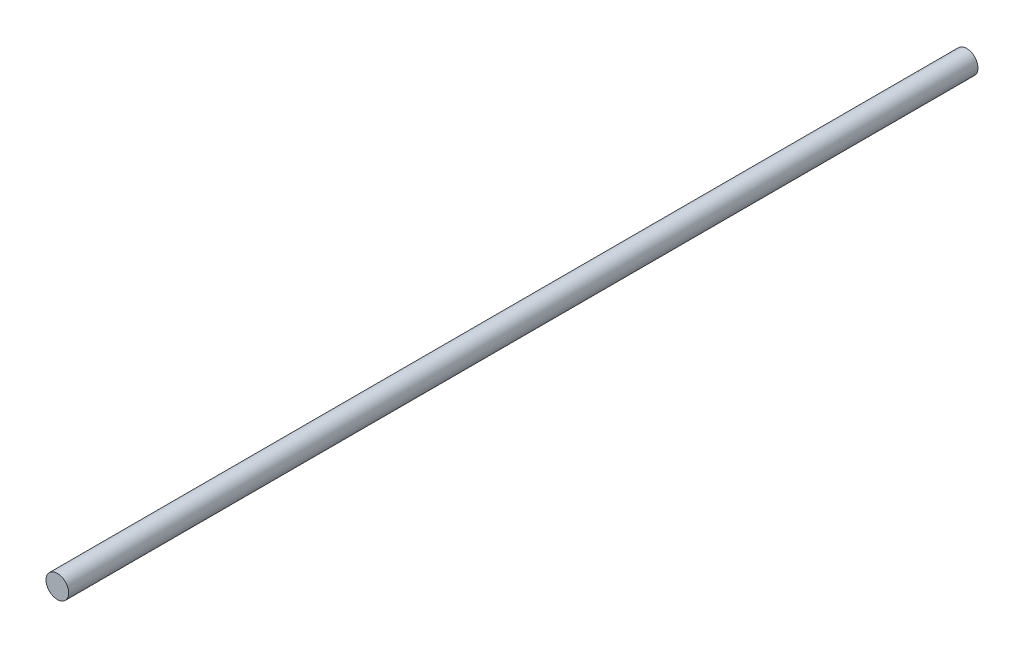
ISO-10303-21;
HEADER;
FILE_DESCRIPTION(('STEP AP214'),'2;1');
FILE_NAME('part.step','',(''),(''),'','','');
FILE_SCHEMA(('AUTOMOTIVE_DESIGN { 1 0 10303 214 1 1 1 1 }'));
ENDSEC;
DATA;
#1=APPLICATION_CONTEXT('core data for automotive mechanical design processes');
#2=APPLICATION_PROTOCOL_DEFINITION('international standard','automotive_design',2000,#1);
#3=PRODUCT_CONTEXT('',#1,'mechanical');
#4=PRODUCT('Part','Part','',(#3));
#5=PRODUCT_RELATED_PRODUCT_CATEGORY('part','',(#4));
#6=PRODUCT_DEFINITION_FORMATION('','',#4);
#7=PRODUCT_DEFINITION_CONTEXT('part definition',#1,'design');
#8=PRODUCT_DEFINITION('design','',#6,#7);
#9=PRODUCT_DEFINITION_SHAPE('','',#8);
#10=(LENGTH_UNIT() NAMED_UNIT(*) SI_UNIT(.MILLI.,.METRE.));
#11=(NAMED_UNIT(*) PLANE_ANGLE_UNIT() SI_UNIT($,.RADIAN.));
#12=(NAMED_UNIT(*) SI_UNIT($,.STERADIAN.) SOLID_ANGLE_UNIT());
#13=UNCERTAINTY_MEASURE_WITH_UNIT(LENGTH_MEASURE(1.E-05),#10,'distance_accuracy_value','');
#14=(GEOMETRIC_REPRESENTATION_CONTEXT(3) GLOBAL_UNCERTAINTY_ASSIGNED_CONTEXT((#13)) GLOBAL_UNIT_ASSIGNED_CONTEXT((#10,
#11,#12)) REPRESENTATION_CONTEXT('',''));
#15=CARTESIAN_POINT('',(0.,0.,0.));
#16=DIRECTION('',(0.,0.,1.));
#17=DIRECTION('',(1.,0.,0.));
#18=AXIS2_PLACEMENT_3D('',#15,#16,#17);
#19=CARTESIAN_POINT('',(0.,0.,4000.));
#20=DIRECTION('',(0.,0.,-1.));
#21=DIRECTION('',(-1.,0.,0.));
#22=AXIS2_PLACEMENT_3D('',#19,#20,#21);
#23=CYLINDRICAL_SURFACE('',#22,50.);
#24=CARTESIAN_POINT('',(0.,0.,4000.));
#25=DIRECTION('',(0.,0.,1.));
#26=DIRECTION('',(1.,0.,0.));
#27=AXIS2_PLACEMENT_3D('',#24,#25,#26);
#28=CIRCLE('',#27,50.);
#29=CARTESIAN_POINT('',(50.,0.,4000.));
#30=VERTEX_POINT('',#29);
#31=EDGE_CURVE('E10',#30,#30,#28,.T.);
#32=ORIENTED_EDGE('',*,*,#31,.F.);
#33=EDGE_LOOP('',(#32));
#34=FACE_BOUND('',#33,.T.);
#35=CARTESIAN_POINT('',(0.,0.,0.));
#36=DIRECTION('',(0.,0.,1.));
#37=DIRECTION('',(1.,0.,0.));
#38=AXIS2_PLACEMENT_3D('',#35,#36,#37);
#39=CIRCLE('',#38,50.);
#40=CARTESIAN_POINT('',(50.,0.,0.));
#41=VERTEX_POINT('',#40);
#42=EDGE_CURVE('E40',#41,#41,#39,.T.);
#43=ORIENTED_EDGE('',*,*,#42,.T.);
#44=EDGE_LOOP('',(#43));
#45=FACE_BOUND('',#44,.T.);
#46=ADVANCED_FACE('F37',(#34,#45),#23,.T.);
#47=CARTESIAN_POINT('',(0.,0.,4000.));
#48=DIRECTION('',(0.,0.,1.));
#49=DIRECTION('',(1.,0.,0.));
#50=AXIS2_PLACEMENT_3D('',#47,#48,#49);
#51=PLANE('',#50);
#52=ORIENTED_EDGE('',*,*,#31,.T.);
#53=EDGE_LOOP('',(#52));
#54=FACE_BOUND('',#53,.T.);
#55=ADVANCED_FACE('F54',(#54),#51,.T.);
#56=CARTESIAN_POINT('',(0.,0.,0.));
#57=DIRECTION('',(0.,0.,1.));
#58=DIRECTION('',(1.,0.,0.));
#59=AXIS2_PLACEMENT_3D('',#56,#57,#58);
#60=PLANE('',#59);
#61=ORIENTED_EDGE('',*,*,#42,.F.);
#62=EDGE_LOOP('',(#61));
#63=FACE_BOUND('',#62,.T.);
#64=ADVANCED_FACE('F52',(#63),#60,.F.);
#65=CLOSED_SHELL('',(#46,#55,#64));
#66=MANIFOLD_SOLID_BREP('B2',#65);
#67=ADVANCED_BREP_SHAPE_REPRESENTATION('',(#18,#66),#14);
#68=SHAPE_DEFINITION_REPRESENTATION(#9,#67);
ENDSEC;
END-ISO-10303-21;
